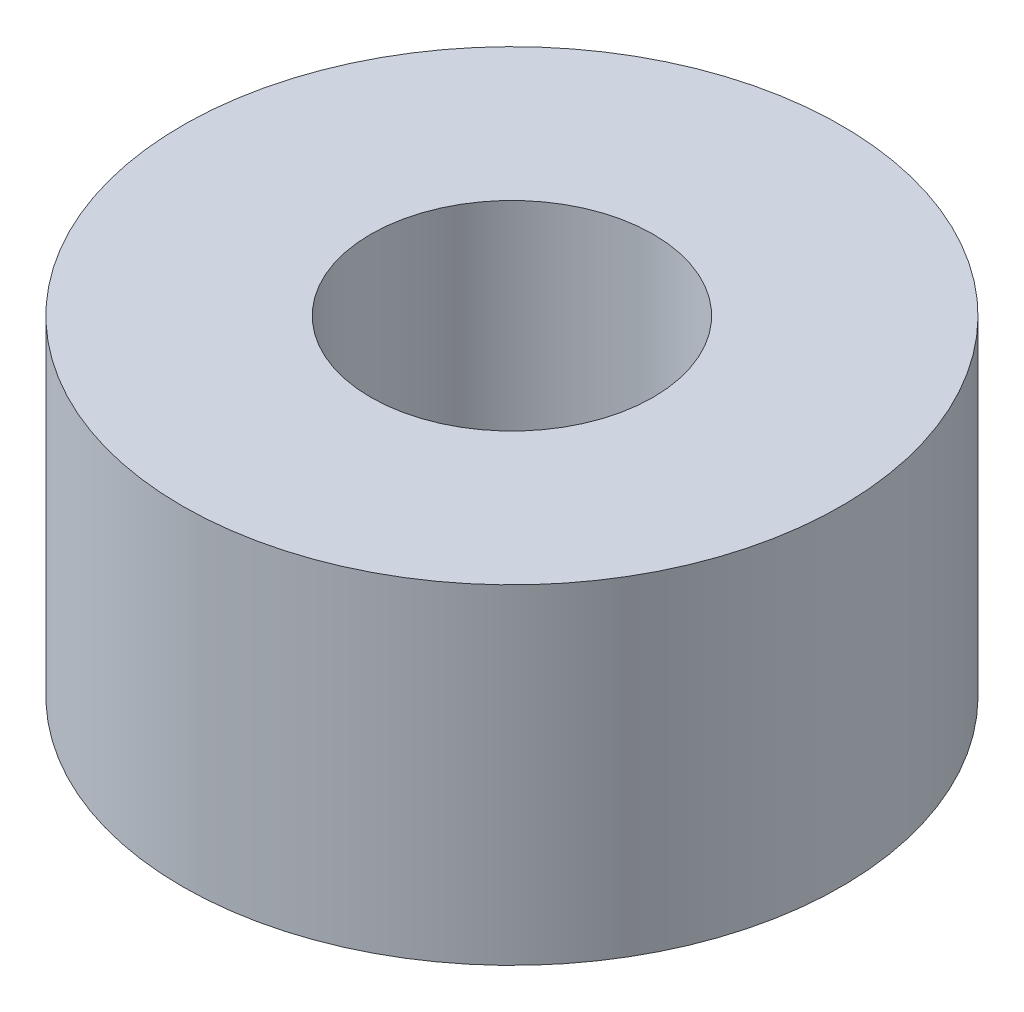
ISO-10303-21;
HEADER;
FILE_DESCRIPTION(('STEP AP214'),'2;1');
FILE_NAME('part.step','',(''),(''),'','','');
FILE_SCHEMA(('AUTOMOTIVE_DESIGN { 1 0 10303 214 1 1 1 1 }'));
ENDSEC;
DATA;
#1=APPLICATION_CONTEXT('core data for automotive mechanical design processes');
#2=APPLICATION_PROTOCOL_DEFINITION('international standard','automotive_design',2000,#1);
#3=PRODUCT_CONTEXT('',#1,'mechanical');
#4=PRODUCT('Part','Part','',(#3));
#5=PRODUCT_RELATED_PRODUCT_CATEGORY('part','',(#4));
#6=PRODUCT_DEFINITION_FORMATION('','',#4);
#7=PRODUCT_DEFINITION_CONTEXT('part definition',#1,'design');
#8=PRODUCT_DEFINITION('design','',#6,#7);
#9=PRODUCT_DEFINITION_SHAPE('','',#8);
#10=(LENGTH_UNIT() NAMED_UNIT(*) SI_UNIT(.MILLI.,.METRE.));
#11=(NAMED_UNIT(*) PLANE_ANGLE_UNIT() SI_UNIT($,.RADIAN.));
#12=(NAMED_UNIT(*) SI_UNIT($,.STERADIAN.) SOLID_ANGLE_UNIT());
#13=UNCERTAINTY_MEASURE_WITH_UNIT(LENGTH_MEASURE(1.E-05),#10,'distance_accuracy_value','');
#14=(GEOMETRIC_REPRESENTATION_CONTEXT(3) GLOBAL_UNCERTAINTY_ASSIGNED_CONTEXT((#13)) GLOBAL_UNIT_ASSIGNED_CONTEXT((#10,
#11,#12)) REPRESENTATION_CONTEXT('',''));
#15=CARTESIAN_POINT('',(0.,0.,0.));
#16=DIRECTION('',(0.,0.,1.));
#17=DIRECTION('',(1.,0.,0.));
#18=AXIS2_PLACEMENT_3D('',#15,#16,#17);
#19=CARTESIAN_POINT('',(0.,8.89,0.));
#20=DIRECTION('',(0.,1.,0.));
#21=DIRECTION('',(0.,0.,1.));
#22=AXIS2_PLACEMENT_3D('',#19,#20,#21);
#23=PLANE('',#22);
#24=CARTESIAN_POINT('',(0.,8.89,0.));
#25=DIRECTION('',(0.,1.,0.));
#26=DIRECTION('',(0.,0.,1.));
#27=AXIS2_PLACEMENT_3D('',#24,#25,#26);
#28=CIRCLE('',#27,8.89);
#29=CARTESIAN_POINT('',(0.,8.89,8.89));
#30=VERTEX_POINT('',#29);
#31=EDGE_CURVE('E10',#30,#30,#28,.T.);
#32=ORIENTED_EDGE('',*,*,#31,.T.);
#33=EDGE_LOOP('',(#32));
#34=FACE_BOUND('',#33,.T.);
#35=CARTESIAN_POINT('',(0.,8.89,0.));
#36=DIRECTION('',(0.,1.,0.));
#37=DIRECTION('',(0.,0.,1.));
#38=AXIS2_PLACEMENT_3D('',#35,#36,#37);
#39=CIRCLE('',#38,3.81);
#40=CARTESIAN_POINT('',(0.,8.89,3.81));
#41=VERTEX_POINT('',#40);
#42=EDGE_CURVE('E54',#41,#41,#39,.T.);
#43=ORIENTED_EDGE('',*,*,#42,.F.);
#44=EDGE_LOOP('',(#43));
#45=FACE_BOUND('',#44,.T.);
#46=ADVANCED_FACE('F41',(#34,#45),#23,.T.);
#47=CARTESIAN_POINT('',(0.,0.,0.));
#48=DIRECTION('',(0.,1.,0.));
#49=DIRECTION('',(0.,0.,1.));
#50=AXIS2_PLACEMENT_3D('',#47,#48,#49);
#51=PLANE('',#50);
#52=CARTESIAN_POINT('',(0.,0.,0.));
#53=DIRECTION('',(0.,1.,0.));
#54=DIRECTION('',(0.,0.,1.));
#55=AXIS2_PLACEMENT_3D('',#52,#53,#54);
#56=CIRCLE('',#55,8.89);
#57=CARTESIAN_POINT('',(0.,0.,8.89));
#58=VERTEX_POINT('',#57);
#59=EDGE_CURVE('E45',#58,#58,#56,.T.);
#60=ORIENTED_EDGE('',*,*,#59,.F.);
#61=EDGE_LOOP('',(#60));
#62=FACE_BOUND('',#61,.T.);
#63=CARTESIAN_POINT('',(0.,0.,0.));
#64=DIRECTION('',(0.,1.,0.));
#65=DIRECTION('',(0.,0.,1.));
#66=AXIS2_PLACEMENT_3D('',#63,#64,#65);
#67=CIRCLE('',#66,3.81);
#68=CARTESIAN_POINT('',(0.,0.,3.81));
#69=VERTEX_POINT('',#68);
#70=EDGE_CURVE('E56',#69,#69,#67,.T.);
#71=ORIENTED_EDGE('',*,*,#70,.T.);
#72=EDGE_LOOP('',(#71));
#73=FACE_BOUND('',#72,.T.);
#74=ADVANCED_FACE('F68',(#62,#73),#51,.F.);
#75=CARTESIAN_POINT('',(0.,8.89,0.));
#76=DIRECTION('',(0.,-1.,0.));
#77=DIRECTION('',(0.,0.,-1.));
#78=AXIS2_PLACEMENT_3D('',#75,#76,#77);
#79=CYLINDRICAL_SURFACE('',#78,8.89);
#80=ORIENTED_EDGE('',*,*,#31,.F.);
#81=EDGE_LOOP('',(#80));
#82=FACE_BOUND('',#81,.T.);
#83=ORIENTED_EDGE('',*,*,#59,.T.);
#84=EDGE_LOOP('',(#83));
#85=FACE_BOUND('',#84,.T.);
#86=ADVANCED_FACE('F43',(#82,#85),#79,.T.);
#87=CARTESIAN_POINT('',(0.,8.89,0.));
#88=DIRECTION('',(0.,-1.,0.));
#89=DIRECTION('',(0.,0.,-1.));
#90=AXIS2_PLACEMENT_3D('',#87,#88,#89);
#91=CYLINDRICAL_SURFACE('',#90,3.81);
#92=ORIENTED_EDGE('',*,*,#42,.T.);
#93=EDGE_LOOP('',(#92));
#94=FACE_BOUND('',#93,.T.);
#95=ORIENTED_EDGE('',*,*,#70,.F.);
#96=EDGE_LOOP('',(#95));
#97=FACE_BOUND('',#96,.T.);
#98=ADVANCED_FACE('F64',(#94,#97),#91,.F.);
#99=CLOSED_SHELL('',(#46,#74,#86,#98));
#100=MANIFOLD_SOLID_BREP('B2',#99);
#101=ADVANCED_BREP_SHAPE_REPRESENTATION('',(#18,#100),#14);
#102=SHAPE_DEFINITION_REPRESENTATION(#9,#101);
ENDSEC;
END-ISO-10303-21;
